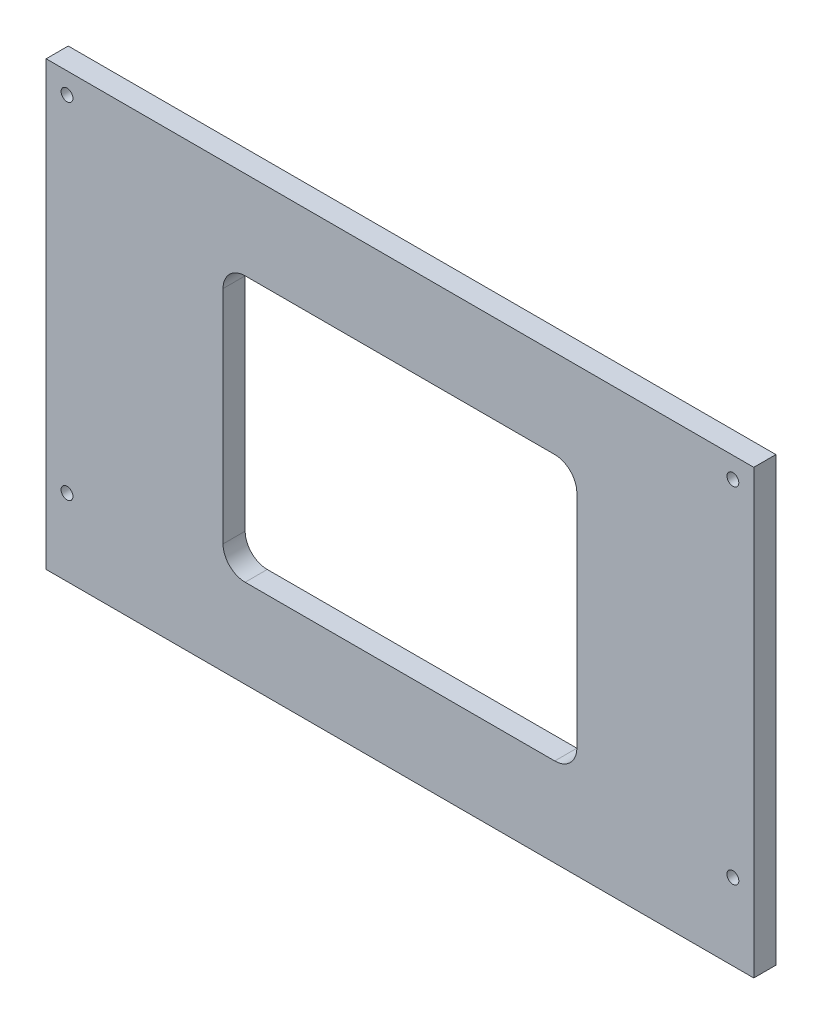
ISO-10303-21;
HEADER;
FILE_DESCRIPTION(('STEP AP214'),'2;1');
FILE_NAME('part.step','',(''),(''),'','','');
FILE_SCHEMA(('AUTOMOTIVE_DESIGN { 1 0 10303 214 1 1 1 1 }'));
ENDSEC;
DATA;
#1=APPLICATION_CONTEXT('core data for automotive mechanical design processes');
#2=APPLICATION_PROTOCOL_DEFINITION('international standard','automotive_design',2000,#1);
#3=PRODUCT_CONTEXT('',#1,'mechanical');
#4=PRODUCT('Part','Part','',(#3));
#5=PRODUCT_RELATED_PRODUCT_CATEGORY('part','',(#4));
#6=PRODUCT_DEFINITION_FORMATION('','',#4);
#7=PRODUCT_DEFINITION_CONTEXT('part definition',#1,'design');
#8=PRODUCT_DEFINITION('design','',#6,#7);
#9=PRODUCT_DEFINITION_SHAPE('','',#8);
#10=(LENGTH_UNIT() NAMED_UNIT(*) SI_UNIT(.MILLI.,.METRE.));
#11=(NAMED_UNIT(*) PLANE_ANGLE_UNIT() SI_UNIT($,.RADIAN.));
#12=(NAMED_UNIT(*) SI_UNIT($,.STERADIAN.) SOLID_ANGLE_UNIT());
#13=UNCERTAINTY_MEASURE_WITH_UNIT(LENGTH_MEASURE(1.E-05),#10,'distance_accuracy_value','');
#14=(GEOMETRIC_REPRESENTATION_CONTEXT(3) GLOBAL_UNCERTAINTY_ASSIGNED_CONTEXT((#13)) GLOBAL_UNIT_ASSIGNED_CONTEXT((#10,
#11,#12)) REPRESENTATION_CONTEXT('',''));
#15=CARTESIAN_POINT('',(0.,0.,0.));
#16=DIRECTION('',(0.,0.,1.));
#17=DIRECTION('',(1.,0.,0.));
#18=AXIS2_PLACEMENT_3D('',#15,#16,#17);
#19=CARTESIAN_POINT('',(0.,127.,6.35));
#20=DIRECTION('',(1.,0.,0.));
#21=DIRECTION('',(0.,1.,0.));
#22=AXIS2_PLACEMENT_3D('',#19,#20,#21);
#23=PLANE('',#22);
#24=DIRECTION('',(0.,-1.,0.));
#25=VECTOR('',#24,1.);
#26=CARTESIAN_POINT('',(0.,127.,0.));
#27=LINE('',#26,#25);
#28=CARTESIAN_POINT('',(0.,127.,0.));
#29=VERTEX_POINT('',#28);
#30=CARTESIAN_POINT('',(0.,0.,0.));
#31=VERTEX_POINT('',#30);
#32=EDGE_CURVE('E154',#29,#31,#27,.T.);
#33=ORIENTED_EDGE('',*,*,#32,.T.);
#34=DIRECTION('',(0.,0.,-1.));
#35=VECTOR('',#34,1.);
#36=CARTESIAN_POINT('',(0.,0.,6.35));
#37=LINE('',#36,#35);
#38=CARTESIAN_POINT('',(0.,0.,6.35));
#39=VERTEX_POINT('',#38);
#40=EDGE_CURVE('E135',#39,#31,#37,.T.);
#41=ORIENTED_EDGE('',*,*,#40,.F.);
#42=DIRECTION('',(0.,-1.,0.));
#43=VECTOR('',#42,1.);
#44=CARTESIAN_POINT('',(0.,127.,6.35));
#45=LINE('',#44,#43);
#46=CARTESIAN_POINT('',(0.,127.,6.35));
#47=VERTEX_POINT('',#46);
#48=EDGE_CURVE('E142',#47,#39,#45,.T.);
#49=ORIENTED_EDGE('',*,*,#48,.F.);
#50=DIRECTION('',(0.,0.,-1.));
#51=VECTOR('',#50,1.);
#52=CARTESIAN_POINT('',(0.,127.,6.35));
#53=LINE('',#52,#51);
#54=EDGE_CURVE('E250',#47,#29,#53,.T.);
#55=ORIENTED_EDGE('',*,*,#54,.T.);
#56=EDGE_LOOP('',(#33,#41,#49,#55));
#57=FACE_BOUND('',#56,.T.);
#58=ADVANCED_FACE('F42',(#57),#23,.F.);
#59=CARTESIAN_POINT('',(203.2,0.,6.35));
#60=DIRECTION('',(0.,1.,0.));
#61=DIRECTION('',(-1.,0.,0.));
#62=AXIS2_PLACEMENT_3D('',#59,#60,#61);
#63=PLANE('',#62);
#64=DIRECTION('',(1.,0.,0.));
#65=VECTOR('',#64,1.);
#66=CARTESIAN_POINT('',(203.2,0.,0.));
#67=LINE('',#66,#65);
#68=CARTESIAN_POINT('',(203.2,0.,0.));
#69=VERTEX_POINT('',#68);
#70=EDGE_CURVE('E252',#31,#69,#67,.T.);
#71=ORIENTED_EDGE('',*,*,#70,.T.);
#72=DIRECTION('',(0.,0.,-1.));
#73=VECTOR('',#72,1.);
#74=CARTESIAN_POINT('',(203.2,0.,6.35));
#75=LINE('',#74,#73);
#76=CARTESIAN_POINT('',(203.2,0.,6.35));
#77=VERTEX_POINT('',#76);
#78=EDGE_CURVE('E138',#77,#69,#75,.T.);
#79=ORIENTED_EDGE('',*,*,#78,.F.);
#80=DIRECTION('',(1.,0.,0.));
#81=VECTOR('',#80,1.);
#82=CARTESIAN_POINT('',(203.2,0.,6.35));
#83=LINE('',#82,#81);
#84=EDGE_CURVE('E131',#39,#77,#83,.T.);
#85=ORIENTED_EDGE('',*,*,#84,.F.);
#86=ORIENTED_EDGE('',*,*,#40,.T.);
#87=EDGE_LOOP('',(#71,#79,#85,#86));
#88=FACE_BOUND('',#87,.T.);
#89=ADVANCED_FACE('F133',(#88),#63,.F.);
#90=CARTESIAN_POINT('',(203.2,127.,6.35));
#91=DIRECTION('',(-1.,0.,0.));
#92=DIRECTION('',(0.,-1.,0.));
#93=AXIS2_PLACEMENT_3D('',#90,#91,#92);
#94=PLANE('',#93);
#95=DIRECTION('',(0.,1.,0.));
#96=VECTOR('',#95,1.);
#97=CARTESIAN_POINT('',(203.2,127.,0.));
#98=LINE('',#97,#96);
#99=CARTESIAN_POINT('',(203.2,127.,0.));
#100=VERTEX_POINT('',#99);
#101=EDGE_CURVE('E254',#69,#100,#98,.T.);
#102=ORIENTED_EDGE('',*,*,#101,.T.);
#103=DIRECTION('',(0.,0.,-1.));
#104=VECTOR('',#103,1.);
#105=CARTESIAN_POINT('',(203.2,127.,6.35));
#106=LINE('',#105,#104);
#107=CARTESIAN_POINT('',(203.2,127.,6.35));
#108=VERTEX_POINT('',#107);
#109=EDGE_CURVE('E159',#108,#100,#106,.T.);
#110=ORIENTED_EDGE('',*,*,#109,.F.);
#111=DIRECTION('',(0.,1.,0.));
#112=VECTOR('',#111,1.);
#113=CARTESIAN_POINT('',(203.2,127.,6.35));
#114=LINE('',#113,#112);
#115=EDGE_CURVE('E141',#77,#108,#114,.T.);
#116=ORIENTED_EDGE('',*,*,#115,.F.);
#117=ORIENTED_EDGE('',*,*,#78,.T.);
#118=EDGE_LOOP('',(#102,#110,#116,#117));
#119=FACE_BOUND('',#118,.T.);
#120=ADVANCED_FACE('F266',(#119),#94,.F.);
#121=CARTESIAN_POINT('',(203.2,127.,6.35));
#122=DIRECTION('',(0.,-1.,0.));
#123=DIRECTION('',(1.,0.,0.));
#124=AXIS2_PLACEMENT_3D('',#121,#122,#123);
#125=PLANE('',#124);
#126=DIRECTION('',(-1.,0.,0.));
#127=VECTOR('',#126,1.);
#128=CARTESIAN_POINT('',(203.2,127.,0.));
#129=LINE('',#128,#127);
#130=EDGE_CURVE('E151',#100,#29,#129,.T.);
#131=ORIENTED_EDGE('',*,*,#130,.T.);
#132=ORIENTED_EDGE('',*,*,#54,.F.);
#133=DIRECTION('',(-1.,0.,0.));
#134=VECTOR('',#133,1.);
#135=CARTESIAN_POINT('',(203.2,127.,6.35));
#136=LINE('',#135,#134);
#137=EDGE_CURVE('E147',#108,#47,#136,.T.);
#138=ORIENTED_EDGE('',*,*,#137,.F.);
#139=ORIENTED_EDGE('',*,*,#109,.T.);
#140=EDGE_LOOP('',(#131,#132,#138,#139));
#141=FACE_BOUND('',#140,.T.);
#142=ADVANCED_FACE('F261',(#141),#125,.F.);
#143=CARTESIAN_POINT('',(0.,0.,6.35));
#144=DIRECTION('',(0.,0.,-1.));
#145=DIRECTION('',(-1.,0.,0.));
#146=AXIS2_PLACEMENT_3D('',#143,#144,#145);
#147=PLANE('',#146);
#148=DIRECTION('',(-1.,0.,0.));
#149=VECTOR('',#148,1.);
#150=CARTESIAN_POINT('',(50.8,101.6,6.35));
#151=LINE('',#150,#149);
#152=CARTESIAN_POINT('',(146.05,101.6,6.35));
#153=VERTEX_POINT('',#152);
#154=CARTESIAN_POINT('',(57.15,101.6,6.35));
#155=VERTEX_POINT('',#154);
#156=EDGE_CURVE('E195',#153,#155,#151,.T.);
#157=ORIENTED_EDGE('',*,*,#156,.F.);
#158=CARTESIAN_POINT('',(146.05,95.25,6.35));
#159=DIRECTION('',(0.,0.,-1.));
#160=DIRECTION('',(-1.,0.,0.));
#161=AXIS2_PLACEMENT_3D('',#158,#159,#160);
#162=CIRCLE('',#161,6.35);
#163=CARTESIAN_POINT('',(152.4,95.25,6.35));
#164=VERTEX_POINT('',#163);
#165=EDGE_CURVE('E179',#153,#164,#162,.T.);
#166=ORIENTED_EDGE('',*,*,#165,.T.);
#167=DIRECTION('',(0.,1.,0.));
#168=VECTOR('',#167,1.);
#169=CARTESIAN_POINT('',(152.4,101.6,6.35));
#170=LINE('',#169,#168);
#171=CARTESIAN_POINT('',(152.4,31.75,6.35));
#172=VERTEX_POINT('',#171);
#173=EDGE_CURVE('E204',#172,#164,#170,.T.);
#174=ORIENTED_EDGE('',*,*,#173,.F.);
#175=CARTESIAN_POINT('',(146.05,31.75,6.35));
#176=DIRECTION('',(0.,0.,-1.));
#177=DIRECTION('',(-1.,0.,0.));
#178=AXIS2_PLACEMENT_3D('',#175,#176,#177);
#179=CIRCLE('',#178,6.35);
#180=CARTESIAN_POINT('',(146.05,25.4,6.35));
#181=VERTEX_POINT('',#180);
#182=EDGE_CURVE('E183',#172,#181,#179,.T.);
#183=ORIENTED_EDGE('',*,*,#182,.T.);
#184=DIRECTION('',(1.,0.,0.));
#185=VECTOR('',#184,1.);
#186=CARTESIAN_POINT('',(50.8,25.4,6.35));
#187=LINE('',#186,#185);
#188=CARTESIAN_POINT('',(57.15,25.4,6.35));
#189=VERTEX_POINT('',#188);
#190=EDGE_CURVE('E222',#189,#181,#187,.T.);
#191=ORIENTED_EDGE('',*,*,#190,.F.);
#192=CARTESIAN_POINT('',(57.15,31.75,6.35));
#193=DIRECTION('',(0.,0.,-1.));
#194=DIRECTION('',(-1.,0.,0.));
#195=AXIS2_PLACEMENT_3D('',#192,#193,#194);
#196=CIRCLE('',#195,6.35);
#197=CARTESIAN_POINT('',(50.8,31.75,6.35));
#198=VERTEX_POINT('',#197);
#199=EDGE_CURVE('E187',#189,#198,#196,.T.);
#200=ORIENTED_EDGE('',*,*,#199,.T.);
#201=DIRECTION('',(0.,-1.,0.));
#202=VECTOR('',#201,1.);
#203=CARTESIAN_POINT('',(50.8,101.6,6.35));
#204=LINE('',#203,#202);
#205=CARTESIAN_POINT('',(50.8,95.25,6.35));
#206=VERTEX_POINT('',#205);
#207=EDGE_CURVE('E196',#206,#198,#204,.T.);
#208=ORIENTED_EDGE('',*,*,#207,.F.);
#209=CARTESIAN_POINT('',(57.15,95.25,6.35));
#210=DIRECTION('',(0.,0.,-1.));
#211=DIRECTION('',(-1.,0.,0.));
#212=AXIS2_PLACEMENT_3D('',#209,#210,#211);
#213=CIRCLE('',#212,6.35);
#214=EDGE_CURVE('E50',#206,#155,#213,.T.);
#215=ORIENTED_EDGE('',*,*,#214,.T.);
#216=EDGE_LOOP('',(#157,#166,#174,#183,#191,#200,#208,#215));
#217=FACE_BOUND('',#216,.T.);
#218=CARTESIAN_POINT('',(5.99440000000001,121.0056,6.35));
#219=DIRECTION('',(0.,0.,1.));
#220=DIRECTION('',(1.,0.,0.));
#221=AXIS2_PLACEMENT_3D('',#218,#219,#220);
#222=CIRCLE('',#221,1.7);
#223=CARTESIAN_POINT('',(7.69440000000001,121.0056,6.35));
#224=VERTEX_POINT('',#223);
#225=EDGE_CURVE('E213',#224,#224,#222,.T.);
#226=ORIENTED_EDGE('',*,*,#225,.F.);
#227=EDGE_LOOP('',(#226));
#228=FACE_BOUND('',#227,.T.);
#229=CARTESIAN_POINT('',(5.99440000000001,21.9964,6.35));
#230=DIRECTION('',(0.,0.,1.));
#231=DIRECTION('',(1.,0.,0.));
#232=AXIS2_PLACEMENT_3D('',#229,#230,#231);
#233=CIRCLE('',#232,1.7);
#234=CARTESIAN_POINT('',(7.69440000000001,21.9964,6.35));
#235=VERTEX_POINT('',#234);
#236=EDGE_CURVE('E230',#235,#235,#233,.T.);
#237=ORIENTED_EDGE('',*,*,#236,.F.);
#238=EDGE_LOOP('',(#237));
#239=FACE_BOUND('',#238,.T.);
#240=CARTESIAN_POINT('',(197.2056,21.9964,6.35));
#241=DIRECTION('',(0.,0.,1.));
#242=DIRECTION('',(1.,0.,0.));
#243=AXIS2_PLACEMENT_3D('',#240,#241,#242);
#244=CIRCLE('',#243,1.70000000000001);
#245=CARTESIAN_POINT('',(198.9056,21.9964,6.35));
#246=VERTEX_POINT('',#245);
#247=EDGE_CURVE('E236',#246,#246,#244,.T.);
#248=ORIENTED_EDGE('',*,*,#247,.F.);
#249=EDGE_LOOP('',(#248));
#250=FACE_BOUND('',#249,.T.);
#251=CARTESIAN_POINT('',(197.2056,121.0056,6.35));
#252=DIRECTION('',(0.,0.,1.));
#253=DIRECTION('',(1.,0.,0.));
#254=AXIS2_PLACEMENT_3D('',#251,#252,#253);
#255=CIRCLE('',#254,1.70000000000001);
#256=CARTESIAN_POINT('',(198.9056,121.0056,6.35));
#257=VERTEX_POINT('',#256);
#258=EDGE_CURVE('E242',#257,#257,#255,.T.);
#259=ORIENTED_EDGE('',*,*,#258,.F.);
#260=EDGE_LOOP('',(#259));
#261=FACE_BOUND('',#260,.T.);
#262=ORIENTED_EDGE('',*,*,#48,.T.);
#263=ORIENTED_EDGE('',*,*,#84,.T.);
#264=ORIENTED_EDGE('',*,*,#115,.T.);
#265=ORIENTED_EDGE('',*,*,#137,.T.);
#266=EDGE_LOOP('',(#262,#263,#264,#265));
#267=FACE_BOUND('',#266,.T.);
#268=ADVANCED_FACE('F145',(#217,#228,#239,#250,#261,#267),#147,.F.);
#269=CARTESIAN_POINT('',(0.,0.,0.));
#270=DIRECTION('',(0.,0.,-1.));
#271=DIRECTION('',(-1.,0.,0.));
#272=AXIS2_PLACEMENT_3D('',#269,#270,#271);
#273=PLANE('',#272);
#274=DIRECTION('',(1.,0.,0.));
#275=VECTOR('',#274,1.);
#276=CARTESIAN_POINT('',(50.8,25.4,0.));
#277=LINE('',#276,#275);
#278=CARTESIAN_POINT('',(57.15,25.4,0.));
#279=VERTEX_POINT('',#278);
#280=CARTESIAN_POINT('',(146.05,25.4,0.));
#281=VERTEX_POINT('',#280);
#282=EDGE_CURVE('E209',#279,#281,#277,.T.);
#283=ORIENTED_EDGE('',*,*,#282,.T.);
#284=CARTESIAN_POINT('',(146.05,31.75,0.));
#285=DIRECTION('',(0.,0.,-1.));
#286=DIRECTION('',(-1.,0.,0.));
#287=AXIS2_PLACEMENT_3D('',#284,#285,#286);
#288=CIRCLE('',#287,6.35);
#289=CARTESIAN_POINT('',(152.4,31.75,0.));
#290=VERTEX_POINT('',#289);
#291=EDGE_CURVE('E185',#281,#290,#288,.F.);
#292=ORIENTED_EDGE('',*,*,#291,.T.);
#293=DIRECTION('',(0.,1.,0.));
#294=VECTOR('',#293,1.);
#295=CARTESIAN_POINT('',(152.4,101.6,0.));
#296=LINE('',#295,#294);
#297=CARTESIAN_POINT('',(152.4,95.25,0.));
#298=VERTEX_POINT('',#297);
#299=EDGE_CURVE('E215',#290,#298,#296,.T.);
#300=ORIENTED_EDGE('',*,*,#299,.T.);
#301=CARTESIAN_POINT('',(146.05,95.25,0.));
#302=DIRECTION('',(0.,0.,-1.));
#303=DIRECTION('',(-1.,0.,0.));
#304=AXIS2_PLACEMENT_3D('',#301,#302,#303);
#305=CIRCLE('',#304,6.35);
#306=CARTESIAN_POINT('',(146.05,101.6,0.));
#307=VERTEX_POINT('',#306);
#308=EDGE_CURVE('E181',#298,#307,#305,.F.);
#309=ORIENTED_EDGE('',*,*,#308,.T.);
#310=DIRECTION('',(-1.,0.,0.));
#311=VECTOR('',#310,1.);
#312=CARTESIAN_POINT('',(50.8,101.6,0.));
#313=LINE('',#312,#311);
#314=CARTESIAN_POINT('',(57.15,101.6,0.));
#315=VERTEX_POINT('',#314);
#316=EDGE_CURVE('E210',#307,#315,#313,.T.);
#317=ORIENTED_EDGE('',*,*,#316,.T.);
#318=CARTESIAN_POINT('',(57.15,95.25,0.));
#319=DIRECTION('',(0.,0.,-1.));
#320=DIRECTION('',(-1.,0.,0.));
#321=AXIS2_PLACEMENT_3D('',#318,#319,#320);
#322=CIRCLE('',#321,6.35);
#323=CARTESIAN_POINT('',(50.8,95.25,0.));
#324=VERTEX_POINT('',#323);
#325=EDGE_CURVE('E11',#315,#324,#322,.F.);
#326=ORIENTED_EDGE('',*,*,#325,.T.);
#327=DIRECTION('',(0.,-1.,0.));
#328=VECTOR('',#327,1.);
#329=CARTESIAN_POINT('',(50.8,101.6,0.));
#330=LINE('',#329,#328);
#331=CARTESIAN_POINT('',(50.8,31.75,0.));
#332=VERTEX_POINT('',#331);
#333=EDGE_CURVE('E207',#324,#332,#330,.T.);
#334=ORIENTED_EDGE('',*,*,#333,.T.);
#335=CARTESIAN_POINT('',(57.15,31.75,0.));
#336=DIRECTION('',(0.,0.,-1.));
#337=DIRECTION('',(-1.,0.,0.));
#338=AXIS2_PLACEMENT_3D('',#335,#336,#337);
#339=CIRCLE('',#338,6.35);
#340=EDGE_CURVE('E189',#332,#279,#339,.F.);
#341=ORIENTED_EDGE('',*,*,#340,.T.);
#342=EDGE_LOOP('',(#283,#292,#300,#309,#317,#326,#334,#341));
#343=FACE_BOUND('',#342,.T.);
#344=CARTESIAN_POINT('',(5.99440000000001,121.0056,0.));
#345=DIRECTION('',(0.,0.,1.));
#346=DIRECTION('',(1.,0.,0.));
#347=AXIS2_PLACEMENT_3D('',#344,#345,#346);
#348=CIRCLE('',#347,1.7);
#349=CARTESIAN_POINT('',(7.69440000000001,121.0056,0.));
#350=VERTEX_POINT('',#349);
#351=EDGE_CURVE('E227',#350,#350,#348,.T.);
#352=ORIENTED_EDGE('',*,*,#351,.T.);
#353=EDGE_LOOP('',(#352));
#354=FACE_BOUND('',#353,.T.);
#355=CARTESIAN_POINT('',(5.99440000000001,21.9964,0.));
#356=DIRECTION('',(0.,0.,1.));
#357=DIRECTION('',(1.,0.,0.));
#358=AXIS2_PLACEMENT_3D('',#355,#356,#357);
#359=CIRCLE('',#358,1.7);
#360=CARTESIAN_POINT('',(7.69440000000001,21.9964,0.));
#361=VERTEX_POINT('',#360);
#362=EDGE_CURVE('E233',#361,#361,#359,.T.);
#363=ORIENTED_EDGE('',*,*,#362,.T.);
#364=EDGE_LOOP('',(#363));
#365=FACE_BOUND('',#364,.T.);
#366=CARTESIAN_POINT('',(197.2056,21.9964,0.));
#367=DIRECTION('',(0.,0.,1.));
#368=DIRECTION('',(1.,0.,0.));
#369=AXIS2_PLACEMENT_3D('',#366,#367,#368);
#370=CIRCLE('',#369,1.70000000000001);
#371=CARTESIAN_POINT('',(198.9056,21.9964,0.));
#372=VERTEX_POINT('',#371);
#373=EDGE_CURVE('E239',#372,#372,#370,.T.);
#374=ORIENTED_EDGE('',*,*,#373,.T.);
#375=EDGE_LOOP('',(#374));
#376=FACE_BOUND('',#375,.T.);
#377=CARTESIAN_POINT('',(197.2056,121.0056,0.));
#378=DIRECTION('',(0.,0.,1.));
#379=DIRECTION('',(1.,0.,0.));
#380=AXIS2_PLACEMENT_3D('',#377,#378,#379);
#381=CIRCLE('',#380,1.70000000000001);
#382=CARTESIAN_POINT('',(198.9056,121.0056,0.));
#383=VERTEX_POINT('',#382);
#384=EDGE_CURVE('E245',#383,#383,#381,.T.);
#385=ORIENTED_EDGE('',*,*,#384,.T.);
#386=EDGE_LOOP('',(#385));
#387=FACE_BOUND('',#386,.T.);
#388=ORIENTED_EDGE('',*,*,#32,.F.);
#389=ORIENTED_EDGE('',*,*,#130,.F.);
#390=ORIENTED_EDGE('',*,*,#101,.F.);
#391=ORIENTED_EDGE('',*,*,#70,.F.);
#392=EDGE_LOOP('',(#388,#389,#390,#391));
#393=FACE_BOUND('',#392,.T.);
#394=ADVANCED_FACE('F265',(#343,#354,#365,#376,#387,#393),#273,.T.);
#395=CARTESIAN_POINT('',(197.2056,121.0056,6.35));
#396=DIRECTION('',(0.,0.,1.));
#397=DIRECTION('',(1.,0.,0.));
#398=AXIS2_PLACEMENT_3D('',#395,#396,#397);
#399=CYLINDRICAL_SURFACE('',#398,1.70000000000001);
#400=ORIENTED_EDGE('',*,*,#384,.F.);
#401=EDGE_LOOP('',(#400));
#402=FACE_BOUND('',#401,.T.);
#403=ORIENTED_EDGE('',*,*,#258,.T.);
#404=EDGE_LOOP('',(#403));
#405=FACE_BOUND('',#404,.T.);
#406=ADVANCED_FACE('F329',(#402,#405),#399,.F.);
#407=CARTESIAN_POINT('',(197.2056,21.9964,6.35));
#408=DIRECTION('',(0.,0.,1.));
#409=DIRECTION('',(1.,0.,0.));
#410=AXIS2_PLACEMENT_3D('',#407,#408,#409);
#411=CYLINDRICAL_SURFACE('',#410,1.70000000000001);
#412=ORIENTED_EDGE('',*,*,#373,.F.);
#413=EDGE_LOOP('',(#412));
#414=FACE_BOUND('',#413,.T.);
#415=ORIENTED_EDGE('',*,*,#247,.T.);
#416=EDGE_LOOP('',(#415));
#417=FACE_BOUND('',#416,.T.);
#418=ADVANCED_FACE('F325',(#414,#417),#411,.F.);
#419=CARTESIAN_POINT('',(5.99440000000001,21.9964,6.35));
#420=DIRECTION('',(0.,0.,1.));
#421=DIRECTION('',(1.,0.,0.));
#422=AXIS2_PLACEMENT_3D('',#419,#420,#421);
#423=CYLINDRICAL_SURFACE('',#422,1.7);
#424=ORIENTED_EDGE('',*,*,#362,.F.);
#425=EDGE_LOOP('',(#424));
#426=FACE_BOUND('',#425,.T.);
#427=ORIENTED_EDGE('',*,*,#236,.T.);
#428=EDGE_LOOP('',(#427));
#429=FACE_BOUND('',#428,.T.);
#430=ADVANCED_FACE('F317',(#426,#429),#423,.F.);
#431=CARTESIAN_POINT('',(5.99440000000001,121.0056,6.35));
#432=DIRECTION('',(0.,0.,1.));
#433=DIRECTION('',(1.,0.,0.));
#434=AXIS2_PLACEMENT_3D('',#431,#432,#433);
#435=CYLINDRICAL_SURFACE('',#434,1.7);
#436=ORIENTED_EDGE('',*,*,#351,.F.);
#437=EDGE_LOOP('',(#436));
#438=FACE_BOUND('',#437,.T.);
#439=ORIENTED_EDGE('',*,*,#225,.T.);
#440=EDGE_LOOP('',(#439));
#441=FACE_BOUND('',#440,.T.);
#442=ADVANCED_FACE('F310',(#438,#441),#435,.F.);
#443=CARTESIAN_POINT('',(152.4,101.6,0.));
#444=DIRECTION('',(1.,0.,0.));
#445=DIRECTION('',(0.,0.,-1.));
#446=AXIS2_PLACEMENT_3D('',#443,#444,#445);
#447=PLANE('',#446);
#448=ORIENTED_EDGE('',*,*,#173,.T.);
#449=DIRECTION('',(0.,0.,1.));
#450=VECTOR('',#449,1.);
#451=CARTESIAN_POINT('',(152.4,95.25,0.));
#452=LINE('',#451,#450);
#453=EDGE_CURVE('E168',#164,#298,#452,.F.);
#454=ORIENTED_EDGE('',*,*,#453,.T.);
#455=ORIENTED_EDGE('',*,*,#299,.F.);
#456=DIRECTION('',(0.,0.,1.));
#457=VECTOR('',#456,1.);
#458=CARTESIAN_POINT('',(152.4,31.75,6.35));
#459=LINE('',#458,#457);
#460=EDGE_CURVE('E165',#290,#172,#459,.T.);
#461=ORIENTED_EDGE('',*,*,#460,.T.);
#462=EDGE_LOOP('',(#448,#454,#455,#461));
#463=FACE_BOUND('',#462,.T.);
#464=ADVANCED_FACE('F306',(#463),#447,.F.);
#465=CARTESIAN_POINT('',(50.8,25.4,0.));
#466=DIRECTION('',(0.,-1.,0.));
#467=DIRECTION('',(0.,0.,-1.));
#468=AXIS2_PLACEMENT_3D('',#465,#466,#467);
#469=PLANE('',#468);
#470=ORIENTED_EDGE('',*,*,#190,.T.);
#471=DIRECTION('',(0.,0.,1.));
#472=VECTOR('',#471,1.);
#473=CARTESIAN_POINT('',(146.05,25.4,0.));
#474=LINE('',#473,#472);
#475=EDGE_CURVE('E173',#181,#281,#474,.F.);
#476=ORIENTED_EDGE('',*,*,#475,.T.);
#477=ORIENTED_EDGE('',*,*,#282,.F.);
#478=DIRECTION('',(0.,0.,1.));
#479=VECTOR('',#478,1.);
#480=CARTESIAN_POINT('',(57.15,25.4,6.35));
#481=LINE('',#480,#479);
#482=EDGE_CURVE('E170',#279,#189,#481,.T.);
#483=ORIENTED_EDGE('',*,*,#482,.T.);
#484=EDGE_LOOP('',(#470,#476,#477,#483));
#485=FACE_BOUND('',#484,.T.);
#486=ADVANCED_FACE('F298',(#485),#469,.F.);
#487=CARTESIAN_POINT('',(50.8,101.6,0.));
#488=DIRECTION('',(-1.,0.,0.));
#489=DIRECTION('',(0.,-1.,0.));
#490=AXIS2_PLACEMENT_3D('',#487,#488,#489);
#491=PLANE('',#490);
#492=ORIENTED_EDGE('',*,*,#207,.T.);
#493=DIRECTION('',(0.,0.,1.));
#494=VECTOR('',#493,1.);
#495=CARTESIAN_POINT('',(50.8,31.75,0.));
#496=LINE('',#495,#494);
#497=EDGE_CURVE('E57',#198,#332,#496,.F.);
#498=ORIENTED_EDGE('',*,*,#497,.T.);
#499=ORIENTED_EDGE('',*,*,#333,.F.);
#500=DIRECTION('',(0.,0.,1.));
#501=VECTOR('',#500,1.);
#502=CARTESIAN_POINT('',(50.8,95.25,6.35));
#503=LINE('',#502,#501);
#504=EDGE_CURVE('E175',#324,#206,#503,.T.);
#505=ORIENTED_EDGE('',*,*,#504,.T.);
#506=EDGE_LOOP('',(#492,#498,#499,#505));
#507=FACE_BOUND('',#506,.T.);
#508=ADVANCED_FACE('F206',(#507),#491,.F.);
#509=CARTESIAN_POINT('',(50.8,101.6,0.));
#510=DIRECTION('',(0.,1.,0.));
#511=DIRECTION('',(0.,0.,1.));
#512=AXIS2_PLACEMENT_3D('',#509,#510,#511);
#513=PLANE('',#512);
#514=ORIENTED_EDGE('',*,*,#316,.F.);
#515=DIRECTION('',(0.,0.,1.));
#516=VECTOR('',#515,1.);
#517=CARTESIAN_POINT('',(146.05,101.6,6.35));
#518=LINE('',#517,#516);
#519=EDGE_CURVE('E157',#307,#153,#518,.T.);
#520=ORIENTED_EDGE('',*,*,#519,.T.);
#521=ORIENTED_EDGE('',*,*,#156,.T.);
#522=DIRECTION('',(0.,0.,1.));
#523=VECTOR('',#522,1.);
#524=CARTESIAN_POINT('',(57.15,101.6,0.));
#525=LINE('',#524,#523);
#526=EDGE_CURVE('E155',#155,#315,#525,.F.);
#527=ORIENTED_EDGE('',*,*,#526,.T.);
#528=EDGE_LOOP('',(#514,#520,#521,#527));
#529=FACE_BOUND('',#528,.T.);
#530=ADVANCED_FACE('F202',(#529),#513,.F.);
#531=CARTESIAN_POINT('',(146.05,95.25,0.));
#532=DIRECTION('',(0.,0.,-1.));
#533=DIRECTION('',(-1.,0.,0.));
#534=AXIS2_PLACEMENT_3D('',#531,#532,#533);
#535=CYLINDRICAL_SURFACE('',#534,6.35);
#536=ORIENTED_EDGE('',*,*,#308,.F.);
#537=ORIENTED_EDGE('',*,*,#453,.F.);
#538=ORIENTED_EDGE('',*,*,#165,.F.);
#539=ORIENTED_EDGE('',*,*,#519,.F.);
#540=EDGE_LOOP('',(#536,#537,#538,#539));
#541=FACE_BOUND('',#540,.T.);
#542=ADVANCED_FACE('F280',(#541),#535,.F.);
#543=CARTESIAN_POINT('',(146.05,31.75,0.));
#544=DIRECTION('',(0.,0.,-1.));
#545=DIRECTION('',(-1.,0.,0.));
#546=AXIS2_PLACEMENT_3D('',#543,#544,#545);
#547=CYLINDRICAL_SURFACE('',#546,6.35);
#548=ORIENTED_EDGE('',*,*,#291,.F.);
#549=ORIENTED_EDGE('',*,*,#475,.F.);
#550=ORIENTED_EDGE('',*,*,#182,.F.);
#551=ORIENTED_EDGE('',*,*,#460,.F.);
#552=EDGE_LOOP('',(#548,#549,#550,#551));
#553=FACE_BOUND('',#552,.T.);
#554=ADVANCED_FACE('F283',(#553),#547,.F.);
#555=CARTESIAN_POINT('',(57.15,31.75,0.));
#556=DIRECTION('',(0.,0.,-1.));
#557=DIRECTION('',(-1.,0.,0.));
#558=AXIS2_PLACEMENT_3D('',#555,#556,#557);
#559=CYLINDRICAL_SURFACE('',#558,6.35);
#560=ORIENTED_EDGE('',*,*,#340,.F.);
#561=ORIENTED_EDGE('',*,*,#497,.F.);
#562=ORIENTED_EDGE('',*,*,#199,.F.);
#563=ORIENTED_EDGE('',*,*,#482,.F.);
#564=EDGE_LOOP('',(#560,#561,#562,#563));
#565=FACE_BOUND('',#564,.T.);
#566=ADVANCED_FACE('F286',(#565),#559,.F.);
#567=CARTESIAN_POINT('',(57.15,95.25,0.));
#568=DIRECTION('',(0.,0.,-1.));
#569=DIRECTION('',(-1.,0.,0.));
#570=AXIS2_PLACEMENT_3D('',#567,#568,#569);
#571=CYLINDRICAL_SURFACE('',#570,6.35);
#572=ORIENTED_EDGE('',*,*,#325,.F.);
#573=ORIENTED_EDGE('',*,*,#526,.F.);
#574=ORIENTED_EDGE('',*,*,#214,.F.);
#575=ORIENTED_EDGE('',*,*,#504,.F.);
#576=EDGE_LOOP('',(#572,#573,#574,#575));
#577=FACE_BOUND('',#576,.T.);
#578=ADVANCED_FACE('F44',(#577),#571,.F.);
#579=CLOSED_SHELL('',(#58,#89,#120,#142,#268,#394,#406,#418,#430,#442,#464,#486,#508,#530,#542,
#554,#566,#578));
#580=MANIFOLD_SOLID_BREP('B2',#579);
#581=ADVANCED_BREP_SHAPE_REPRESENTATION('',(#18,#580),#14);
#582=SHAPE_DEFINITION_REPRESENTATION(#9,#581);
ENDSEC;
END-ISO-10303-21;
